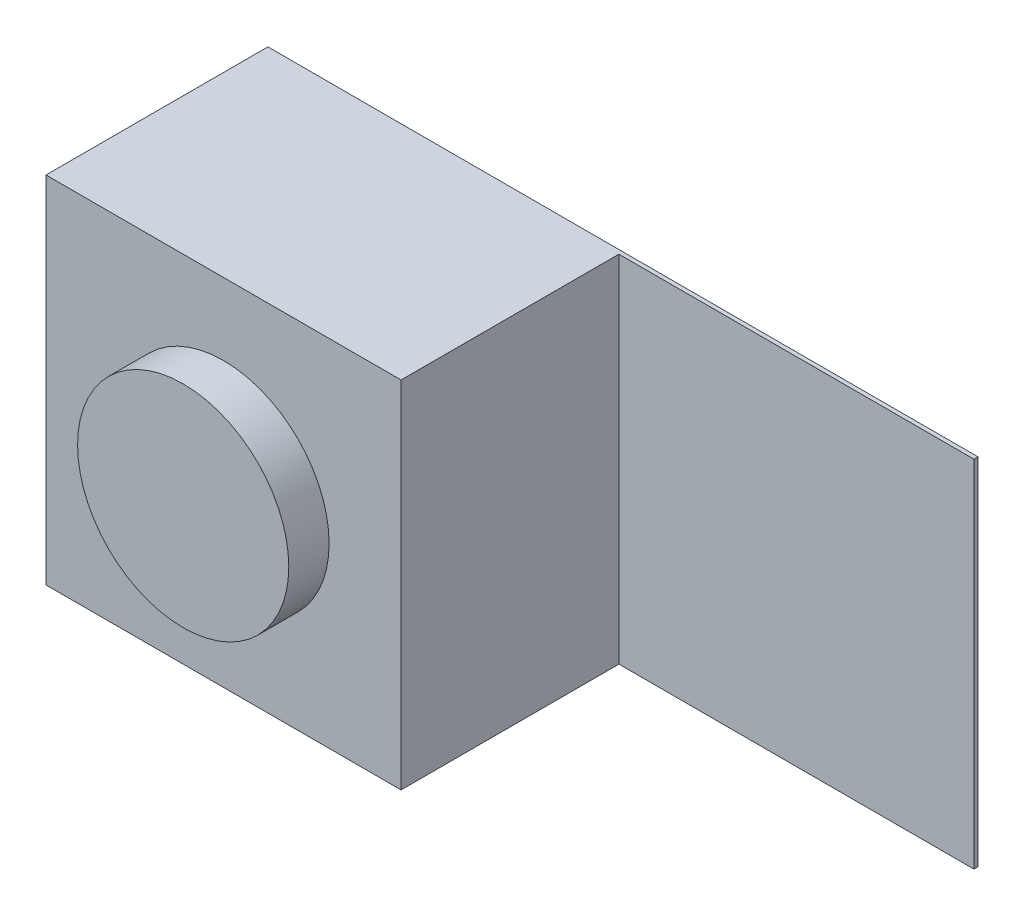
ISO-10303-21;
HEADER;
FILE_DESCRIPTION(('STEP AP214'),'2;1');
FILE_NAME('part.step','',(''),(''),'','','');
FILE_SCHEMA(('AUTOMOTIVE_DESIGN { 1 0 10303 214 1 1 1 1 }'));
ENDSEC;
DATA;
#1=APPLICATION_CONTEXT('core data for automotive mechanical design processes');
#2=APPLICATION_PROTOCOL_DEFINITION('international standard','automotive_design',2000,#1);
#3=PRODUCT_CONTEXT('',#1,'mechanical');
#4=PRODUCT('Part','Part','',(#3));
#5=PRODUCT_RELATED_PRODUCT_CATEGORY('part','',(#4));
#6=PRODUCT_DEFINITION_FORMATION('','',#4);
#7=PRODUCT_DEFINITION_CONTEXT('part definition',#1,'design');
#8=PRODUCT_DEFINITION('design','',#6,#7);
#9=PRODUCT_DEFINITION_SHAPE('','',#8);
#10=(LENGTH_UNIT() NAMED_UNIT(*) SI_UNIT(.MILLI.,.METRE.));
#11=(NAMED_UNIT(*) PLANE_ANGLE_UNIT() SI_UNIT($,.RADIAN.));
#12=(NAMED_UNIT(*) SI_UNIT($,.STERADIAN.) SOLID_ANGLE_UNIT());
#13=UNCERTAINTY_MEASURE_WITH_UNIT(LENGTH_MEASURE(1.E-05),#10,'distance_accuracy_value','');
#14=(GEOMETRIC_REPRESENTATION_CONTEXT(3) GLOBAL_UNCERTAINTY_ASSIGNED_CONTEXT((#13)) GLOBAL_UNIT_ASSIGNED_CONTEXT((#10,
#11,#12)) REPRESENTATION_CONTEXT('',''));
#15=CARTESIAN_POINT('',(0.,0.,0.));
#16=DIRECTION('',(0.,0.,1.));
#17=DIRECTION('',(1.,0.,0.));
#18=AXIS2_PLACEMENT_3D('',#15,#16,#17);
#19=CARTESIAN_POINT('',(4.4,4.4,5.5));
#20=DIRECTION('',(-1.,0.,0.));
#21=DIRECTION('',(0.,-1.,0.));
#22=AXIS2_PLACEMENT_3D('',#19,#20,#21);
#23=PLANE('',#22);
#24=DIRECTION('',(0.,0.,-1.));
#25=VECTOR('',#24,1.);
#26=CARTESIAN_POINT('',(4.4,-4.4,5.5));
#27=LINE('',#26,#25);
#28=CARTESIAN_POINT('',(4.4,-4.4,5.5));
#29=VERTEX_POINT('',#28);
#30=CARTESIAN_POINT('',(4.4,-4.4,0.1));
#31=VERTEX_POINT('',#30);
#32=EDGE_CURVE('E53',#29,#31,#27,.T.);
#33=ORIENTED_EDGE('',*,*,#32,.T.);
#34=DIRECTION('',(0.,1.,0.));
#35=VECTOR('',#34,1.);
#36=CARTESIAN_POINT('',(4.4,4.4,0.1));
#37=LINE('',#36,#35);
#38=CARTESIAN_POINT('',(4.4,4.4,0.1));
#39=VERTEX_POINT('',#38);
#40=EDGE_CURVE('E48',#31,#39,#37,.T.);
#41=ORIENTED_EDGE('',*,*,#40,.T.);
#42=DIRECTION('',(0.,0.,-1.));
#43=VECTOR('',#42,1.);
#44=CARTESIAN_POINT('',(4.4,4.4,5.5));
#45=LINE('',#44,#43);
#46=CARTESIAN_POINT('',(4.4,4.4,5.5));
#47=VERTEX_POINT('',#46);
#48=EDGE_CURVE('E36',#47,#39,#45,.T.);
#49=ORIENTED_EDGE('',*,*,#48,.F.);
#50=DIRECTION('',(0.,1.,0.));
#51=VECTOR('',#50,1.);
#52=CARTESIAN_POINT('',(4.4,4.4,5.5));
#53=LINE('',#52,#51);
#54=EDGE_CURVE('E116',#29,#47,#53,.T.);
#55=ORIENTED_EDGE('',*,*,#54,.F.);
#56=EDGE_LOOP('',(#33,#41,#49,#55));
#57=FACE_BOUND('',#56,.T.);
#58=ADVANCED_FACE('F33',(#57),#23,.F.);
#59=CARTESIAN_POINT('',(-4.4,4.4,5.5));
#60=DIRECTION('',(0.,-1.,0.));
#61=DIRECTION('',(0.,0.,-1.));
#62=AXIS2_PLACEMENT_3D('',#59,#60,#61);
#63=PLANE('',#62);
#64=ORIENTED_EDGE('',*,*,#48,.T.);
#65=DIRECTION('',(1.,0.,0.));
#66=VECTOR('',#65,1.);
#67=CARTESIAN_POINT('',(13.2,4.4,0.1));
#68=LINE('',#67,#66);
#69=CARTESIAN_POINT('',(13.2,4.4,0.1));
#70=VERTEX_POINT('',#69);
#71=EDGE_CURVE('E86',#39,#70,#68,.T.);
#72=ORIENTED_EDGE('',*,*,#71,.T.);
#73=DIRECTION('',(0.,0.,-1.));
#74=VECTOR('',#73,1.);
#75=CARTESIAN_POINT('',(13.2,4.4,0.1));
#76=LINE('',#75,#74);
#77=CARTESIAN_POINT('',(13.2,4.4,0.));
#78=VERTEX_POINT('',#77);
#79=EDGE_CURVE('E90',#70,#78,#76,.T.);
#80=ORIENTED_EDGE('',*,*,#79,.T.);
#81=DIRECTION('',(-1.,0.,0.));
#82=VECTOR('',#81,1.);
#83=CARTESIAN_POINT('',(-4.4,4.4,0.));
#84=LINE('',#83,#82);
#85=CARTESIAN_POINT('',(-4.4,4.4,0.));
#86=VERTEX_POINT('',#85);
#87=EDGE_CURVE('E115',#78,#86,#84,.T.);
#88=ORIENTED_EDGE('',*,*,#87,.T.);
#89=DIRECTION('',(0.,0.,-1.));
#90=VECTOR('',#89,1.);
#91=CARTESIAN_POINT('',(-4.4,4.4,5.5));
#92=LINE('',#91,#90);
#93=CARTESIAN_POINT('',(-4.4,4.4,5.5));
#94=VERTEX_POINT('',#93);
#95=EDGE_CURVE('E133',#94,#86,#92,.T.);
#96=ORIENTED_EDGE('',*,*,#95,.F.);
#97=DIRECTION('',(-1.,0.,0.));
#98=VECTOR('',#97,1.);
#99=CARTESIAN_POINT('',(-4.4,4.4,5.5));
#100=LINE('',#99,#98);
#101=EDGE_CURVE('E119',#47,#94,#100,.T.);
#102=ORIENTED_EDGE('',*,*,#101,.F.);
#103=EDGE_LOOP('',(#64,#72,#80,#88,#96,#102));
#104=FACE_BOUND('',#103,.T.);
#105=ADVANCED_FACE('F88',(#104),#63,.F.);
#106=CARTESIAN_POINT('',(-4.4,4.4,5.5));
#107=DIRECTION('',(1.,0.,0.));
#108=DIRECTION('',(0.,0.,-1.));
#109=AXIS2_PLACEMENT_3D('',#106,#107,#108);
#110=PLANE('',#109);
#111=ORIENTED_EDGE('',*,*,#95,.T.);
#112=DIRECTION('',(0.,-1.,0.));
#113=VECTOR('',#112,1.);
#114=CARTESIAN_POINT('',(-4.4,4.4,0.));
#115=LINE('',#114,#113);
#116=CARTESIAN_POINT('',(-4.4,-4.4,0.));
#117=VERTEX_POINT('',#116);
#118=EDGE_CURVE('E127',#86,#117,#115,.T.);
#119=ORIENTED_EDGE('',*,*,#118,.T.);
#120=DIRECTION('',(0.,0.,-1.));
#121=VECTOR('',#120,1.);
#122=CARTESIAN_POINT('',(-4.4,-4.4,5.5));
#123=LINE('',#122,#121);
#124=CARTESIAN_POINT('',(-4.4,-4.4,5.5));
#125=VERTEX_POINT('',#124);
#126=EDGE_CURVE('E132',#125,#117,#123,.T.);
#127=ORIENTED_EDGE('',*,*,#126,.F.);
#128=DIRECTION('',(0.,-1.,0.));
#129=VECTOR('',#128,1.);
#130=CARTESIAN_POINT('',(-4.4,4.4,5.5));
#131=LINE('',#130,#129);
#132=EDGE_CURVE('E122',#94,#125,#131,.T.);
#133=ORIENTED_EDGE('',*,*,#132,.F.);
#134=EDGE_LOOP('',(#111,#119,#127,#133));
#135=FACE_BOUND('',#134,.T.);
#136=ADVANCED_FACE('F137',(#135),#110,.F.);
#137=CARTESIAN_POINT('',(-4.4,-4.4,5.5));
#138=DIRECTION('',(0.,1.,0.));
#139=DIRECTION('',(0.,0.,1.));
#140=AXIS2_PLACEMENT_3D('',#137,#138,#139);
#141=PLANE('',#140);
#142=ORIENTED_EDGE('',*,*,#126,.T.);
#143=DIRECTION('',(1.,0.,0.));
#144=VECTOR('',#143,1.);
#145=CARTESIAN_POINT('',(-4.4,-4.4,0.));
#146=LINE('',#145,#144);
#147=CARTESIAN_POINT('',(13.2,-4.4,0.));
#148=VERTEX_POINT('',#147);
#149=EDGE_CURVE('E120',#117,#148,#146,.T.);
#150=ORIENTED_EDGE('',*,*,#149,.T.);
#151=DIRECTION('',(0.,0.,-1.));
#152=VECTOR('',#151,1.);
#153=CARTESIAN_POINT('',(13.2,-4.4,0.1));
#154=LINE('',#153,#152);
#155=CARTESIAN_POINT('',(13.2,-4.4,0.1));
#156=VERTEX_POINT('',#155);
#157=EDGE_CURVE('E103',#156,#148,#154,.T.);
#158=ORIENTED_EDGE('',*,*,#157,.F.);
#159=DIRECTION('',(-1.,0.,0.));
#160=VECTOR('',#159,1.);
#161=CARTESIAN_POINT('',(13.2,-4.4,0.1));
#162=LINE('',#161,#160);
#163=EDGE_CURVE('E104',#156,#31,#162,.T.);
#164=ORIENTED_EDGE('',*,*,#163,.T.);
#165=ORIENTED_EDGE('',*,*,#32,.F.);
#166=DIRECTION('',(1.,0.,0.));
#167=VECTOR('',#166,1.);
#168=CARTESIAN_POINT('',(-4.4,-4.4,5.5));
#169=LINE('',#168,#167);
#170=EDGE_CURVE('E124',#125,#29,#169,.T.);
#171=ORIENTED_EDGE('',*,*,#170,.F.);
#172=EDGE_LOOP('',(#142,#150,#158,#164,#165,#171));
#173=FACE_BOUND('',#172,.T.);
#174=ADVANCED_FACE('F144',(#173),#141,.F.);
#175=CARTESIAN_POINT('',(0.,0.,5.5));
#176=DIRECTION('',(0.,0.,1.));
#177=DIRECTION('',(1.,0.,0.));
#178=AXIS2_PLACEMENT_3D('',#175,#176,#177);
#179=PLANE('',#178);
#180=CARTESIAN_POINT('',(0.,0.,5.5));
#181=DIRECTION('',(0.,0.,1.));
#182=DIRECTION('',(1.,0.,0.));
#183=AXIS2_PLACEMENT_3D('',#180,#181,#182);
#184=CIRCLE('',#183,2.61737751134206);
#185=CARTESIAN_POINT('',(2.61737751134206,0.,5.5));
#186=VERTEX_POINT('',#185);
#187=EDGE_CURVE('E11',#186,#186,#184,.T.);
#188=ORIENTED_EDGE('',*,*,#187,.F.);
#189=EDGE_LOOP('',(#188));
#190=FACE_BOUND('',#189,.T.);
#191=ORIENTED_EDGE('',*,*,#54,.T.);
#192=ORIENTED_EDGE('',*,*,#101,.T.);
#193=ORIENTED_EDGE('',*,*,#132,.T.);
#194=ORIENTED_EDGE('',*,*,#170,.T.);
#195=EDGE_LOOP('',(#191,#192,#193,#194));
#196=FACE_BOUND('',#195,.T.);
#197=ADVANCED_FACE('F147',(#190,#196),#179,.T.);
#198=CARTESIAN_POINT('',(0.,0.,0.));
#199=DIRECTION('',(0.,0.,1.));
#200=DIRECTION('',(1.,0.,0.));
#201=AXIS2_PLACEMENT_3D('',#198,#199,#200);
#202=PLANE('',#201);
#203=ORIENTED_EDGE('',*,*,#87,.F.);
#204=DIRECTION('',(0.,-1.,0.));
#205=VECTOR('',#204,1.);
#206=CARTESIAN_POINT('',(13.2,-4.4,0.));
#207=LINE('',#206,#205);
#208=EDGE_CURVE('E95',#78,#148,#207,.T.);
#209=ORIENTED_EDGE('',*,*,#208,.T.);
#210=ORIENTED_EDGE('',*,*,#149,.F.);
#211=ORIENTED_EDGE('',*,*,#118,.F.);
#212=EDGE_LOOP('',(#203,#209,#210,#211));
#213=FACE_BOUND('',#212,.T.);
#214=ADVANCED_FACE('F142',(#213),#202,.F.);
#215=CARTESIAN_POINT('',(0.,0.,0.1));
#216=DIRECTION('',(0.,0.,1.));
#217=DIRECTION('',(1.,0.,0.));
#218=AXIS2_PLACEMENT_3D('',#215,#216,#217);
#219=PLANE('',#218);
#220=ORIENTED_EDGE('',*,*,#40,.F.);
#221=ORIENTED_EDGE('',*,*,#163,.F.);
#222=DIRECTION('',(0.,-1.,0.));
#223=VECTOR('',#222,1.);
#224=CARTESIAN_POINT('',(13.2,-4.4,0.1));
#225=LINE('',#224,#223);
#226=EDGE_CURVE('E94',#70,#156,#225,.T.);
#227=ORIENTED_EDGE('',*,*,#226,.F.);
#228=ORIENTED_EDGE('',*,*,#71,.F.);
#229=EDGE_LOOP('',(#220,#221,#227,#228));
#230=FACE_BOUND('',#229,.T.);
#231=ADVANCED_FACE('F106',(#230),#219,.T.);
#232=CARTESIAN_POINT('',(13.2,-4.4,0.1));
#233=DIRECTION('',(1.,0.,0.));
#234=DIRECTION('',(0.,0.,-1.));
#235=AXIS2_PLACEMENT_3D('',#232,#233,#234);
#236=PLANE('',#235);
#237=ORIENTED_EDGE('',*,*,#208,.F.);
#238=ORIENTED_EDGE('',*,*,#79,.F.);
#239=ORIENTED_EDGE('',*,*,#226,.T.);
#240=ORIENTED_EDGE('',*,*,#157,.T.);
#241=EDGE_LOOP('',(#237,#238,#239,#240));
#242=FACE_BOUND('',#241,.T.);
#243=ADVANCED_FACE('F99',(#242),#236,.T.);
#244=CARTESIAN_POINT('',(0.,0.,6.5));
#245=DIRECTION('',(0.,0.,-1.));
#246=DIRECTION('',(-1.,0.,0.));
#247=AXIS2_PLACEMENT_3D('',#244,#245,#246);
#248=CYLINDRICAL_SURFACE('',#247,2.61737751134206);
#249=CARTESIAN_POINT('',(0.,0.,6.5));
#250=DIRECTION('',(0.,0.,1.));
#251=DIRECTION('',(1.,0.,0.));
#252=AXIS2_PLACEMENT_3D('',#249,#250,#251);
#253=CIRCLE('',#252,2.61737751134206);
#254=CARTESIAN_POINT('',(2.61737751134206,0.,6.5));
#255=VERTEX_POINT('',#254);
#256=EDGE_CURVE('E112',#255,#255,#253,.T.);
#257=ORIENTED_EDGE('',*,*,#256,.F.);
#258=EDGE_LOOP('',(#257));
#259=FACE_BOUND('',#258,.T.);
#260=ORIENTED_EDGE('',*,*,#187,.T.);
#261=EDGE_LOOP('',(#260));
#262=FACE_BOUND('',#261,.T.);
#263=ADVANCED_FACE('F166',(#259,#262),#248,.T.);
#264=CARTESIAN_POINT('',(0.,0.,6.5));
#265=DIRECTION('',(0.,0.,1.));
#266=DIRECTION('',(1.,0.,0.));
#267=AXIS2_PLACEMENT_3D('',#264,#265,#266);
#268=PLANE('',#267);
#269=ORIENTED_EDGE('',*,*,#256,.T.);
#270=EDGE_LOOP('',(#269));
#271=FACE_BOUND('',#270,.T.);
#272=ADVANCED_FACE('F171',(#271),#268,.T.);
#273=CLOSED_SHELL('',(#58,#105,#136,#174,#197,#214,#231,#243,#263,#272));
#274=MANIFOLD_SOLID_BREP('B2',#273);
#275=ADVANCED_BREP_SHAPE_REPRESENTATION('',(#18,#274),#14);
#276=SHAPE_DEFINITION_REPRESENTATION(#9,#275);
ENDSEC;
END-ISO-10303-21;
